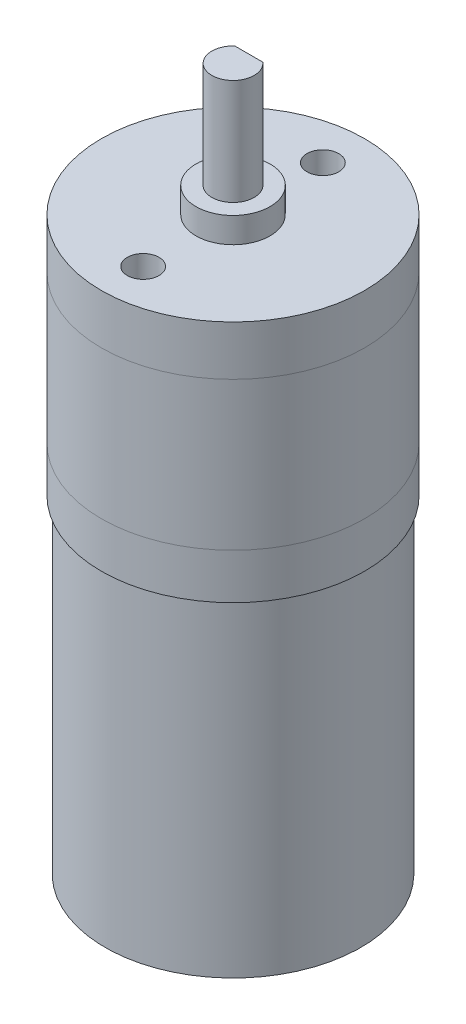
ISO-10303-21;
HEADER;
FILE_DESCRIPTION(('STEP AP214'),'2;1');
FILE_NAME('part.step','',(''),(''),'','','');
FILE_SCHEMA(('AUTOMOTIVE_DESIGN { 1 0 10303 214 1 1 1 1 }'));
ENDSEC;
DATA;
#1=APPLICATION_CONTEXT('core data for automotive mechanical design processes');
#2=APPLICATION_PROTOCOL_DEFINITION('international standard','automotive_design',2000,#1);
#3=PRODUCT_CONTEXT('',#1,'mechanical');
#4=PRODUCT('Part','Part','',(#3));
#5=PRODUCT_RELATED_PRODUCT_CATEGORY('part','',(#4));
#6=PRODUCT_DEFINITION_FORMATION('','',#4);
#7=PRODUCT_DEFINITION_CONTEXT('part definition',#1,'design');
#8=PRODUCT_DEFINITION('design','',#6,#7);
#9=PRODUCT_DEFINITION_SHAPE('','',#8);
#10=(LENGTH_UNIT() NAMED_UNIT(*) SI_UNIT(.MILLI.,.METRE.));
#11=(NAMED_UNIT(*) PLANE_ANGLE_UNIT() SI_UNIT($,.RADIAN.));
#12=(NAMED_UNIT(*) SI_UNIT($,.STERADIAN.) SOLID_ANGLE_UNIT());
#13=UNCERTAINTY_MEASURE_WITH_UNIT(LENGTH_MEASURE(1.E-05),#10,'distance_accuracy_value','');
#14=(GEOMETRIC_REPRESENTATION_CONTEXT(3) GLOBAL_UNCERTAINTY_ASSIGNED_CONTEXT((#13)) GLOBAL_UNIT_ASSIGNED_CONTEXT((#10,
#11,#12)) REPRESENTATION_CONTEXT('',''));
#15=CARTESIAN_POINT('',(0.,0.,0.));
#16=DIRECTION('',(0.,0.,1.));
#17=DIRECTION('',(1.,0.,0.));
#18=AXIS2_PLACEMENT_3D('',#15,#16,#17);
#19=CARTESIAN_POINT('',(0.,-65.4,0.));
#20=DIRECTION('',(0.,-1.,0.));
#21=DIRECTION('',(0.,0.,-1.));
#22=AXIS2_PLACEMENT_3D('',#19,#20,#21);
#23=PLANE('',#22);
#24=CARTESIAN_POINT('',(0.,-65.4,0.));
#25=DIRECTION('',(0.,-1.,0.));
#26=DIRECTION('',(0.,0.,-1.));
#27=AXIS2_PLACEMENT_3D('',#24,#25,#26);
#28=CIRCLE('',#27,11.6);
#29=CARTESIAN_POINT('',(0.,-65.4,-11.6));
#30=VERTEX_POINT('',#29);
#31=EDGE_CURVE('E217',#30,#30,#28,.T.);
#32=ORIENTED_EDGE('',*,*,#31,.T.);
#33=EDGE_LOOP('',(#32));
#34=FACE_BOUND('',#33,.T.);
#35=CARTESIAN_POINT('',(0.,-65.4,0.));
#36=DIRECTION('',(0.,-1.,0.));
#37=DIRECTION('',(0.,0.,-1.));
#38=AXIS2_PLACEMENT_3D('',#35,#36,#37);
#39=CIRCLE('',#38,3.);
#40=CARTESIAN_POINT('',(0.,-65.4,-3.));
#41=VERTEX_POINT('',#40);
#42=EDGE_CURVE('E222',#41,#41,#39,.T.);
#43=ORIENTED_EDGE('',*,*,#42,.F.);
#44=EDGE_LOOP('',(#43));
#45=FACE_BOUND('',#44,.T.);
#46=ADVANCED_FACE('F40',(#34,#45),#23,.T.);
#47=CARTESIAN_POINT('',(0.,-35.4,0.));
#48=DIRECTION('',(0.,-1.,0.));
#49=DIRECTION('',(0.,0.,-1.));
#50=AXIS2_PLACEMENT_3D('',#47,#48,#49);
#51=PLANE('',#50);
#52=CARTESIAN_POINT('',(0.,-35.4,0.));
#53=DIRECTION('',(0.,-1.,0.));
#54=DIRECTION('',(0.,0.,-1.));
#55=AXIS2_PLACEMENT_3D('',#52,#53,#54);
#56=CIRCLE('',#55,12.4500000000001);
#57=CARTESIAN_POINT('',(0.,-35.4,-12.4500000000001));
#58=VERTEX_POINT('',#57);
#59=EDGE_CURVE('E207',#58,#58,#56,.T.);
#60=ORIENTED_EDGE('',*,*,#59,.T.);
#61=EDGE_LOOP('',(#60));
#62=FACE_BOUND('',#61,.T.);
#63=CARTESIAN_POINT('',(0.,-35.4,0.));
#64=DIRECTION('',(0.,-1.,0.));
#65=DIRECTION('',(0.,0.,-1.));
#66=AXIS2_PLACEMENT_3D('',#63,#64,#65);
#67=CIRCLE('',#66,12.1);
#68=CARTESIAN_POINT('',(0.,-35.4,-12.1));
#69=VERTEX_POINT('',#68);
#70=EDGE_CURVE('E213',#69,#69,#67,.T.);
#71=ORIENTED_EDGE('',*,*,#70,.F.);
#72=EDGE_LOOP('',(#71));
#73=FACE_BOUND('',#72,.T.);
#74=ADVANCED_FACE('F141',(#62,#73),#51,.T.);
#75=CARTESIAN_POINT('',(0.,-8.,-1.5));
#76=DIRECTION('',(0.,0.,1.));
#77=DIRECTION('',(1.,0.,0.));
#78=AXIS2_PLACEMENT_3D('',#75,#76,#77);
#79=PLANE('',#78);
#80=DIRECTION('',(1.,0.,0.));
#81=VECTOR('',#80,1.);
#82=CARTESIAN_POINT('',(0.,0.,-1.5));
#83=LINE('',#82,#81);
#84=CARTESIAN_POINT('',(-1.3228756555323,0.,-1.5));
#85=VERTEX_POINT('',#84);
#86=CARTESIAN_POINT('',(1.3228756555323,0.,-1.5));
#87=VERTEX_POINT('',#86);
#88=EDGE_CURVE('E71',#85,#87,#83,.T.);
#89=ORIENTED_EDGE('',*,*,#88,.T.);
#90=DIRECTION('',(0.,1.,0.));
#91=VECTOR('',#90,1.);
#92=CARTESIAN_POINT('',(1.3228756555323,-8.,-1.5));
#93=LINE('',#92,#91);
#94=CARTESIAN_POINT('',(1.32287565553229,-8.,-1.5));
#95=VERTEX_POINT('',#94);
#96=EDGE_CURVE('E66',#95,#87,#93,.T.);
#97=ORIENTED_EDGE('',*,*,#96,.F.);
#98=DIRECTION('',(1.,0.,0.));
#99=VECTOR('',#98,1.);
#100=CARTESIAN_POINT('',(0.,-8.,-1.5));
#101=LINE('',#100,#99);
#102=CARTESIAN_POINT('',(-1.3228756555323,-8.,-1.5));
#103=VERTEX_POINT('',#102);
#104=EDGE_CURVE('E69',#103,#95,#101,.T.);
#105=ORIENTED_EDGE('',*,*,#104,.F.);
#106=DIRECTION('',(0.,1.,0.));
#107=VECTOR('',#106,1.);
#108=CARTESIAN_POINT('',(-1.3228756555323,-8.,-1.5));
#109=LINE('',#108,#107);
#110=EDGE_CURVE('E56',#103,#85,#109,.T.);
#111=ORIENTED_EDGE('',*,*,#110,.T.);
#112=EDGE_LOOP('',(#89,#97,#105,#111));
#113=FACE_BOUND('',#112,.T.);
#114=ADVANCED_FACE('F68',(#113),#79,.F.);
#115=CARTESIAN_POINT('',(0.,-8.,0.));
#116=DIRECTION('',(0.,1.,0.));
#117=DIRECTION('',(0.,0.,1.));
#118=AXIS2_PLACEMENT_3D('',#115,#116,#117);
#119=CYLINDRICAL_SURFACE('',#118,2.);
#120=CARTESIAN_POINT('',(0.,0.,0.));
#121=DIRECTION('',(0.,1.,0.));
#122=DIRECTION('',(0.,0.,1.));
#123=AXIS2_PLACEMENT_3D('',#120,#121,#122);
#124=CIRCLE('',#123,2.);
#125=EDGE_CURVE('E77',#85,#87,#124,.T.);
#126=ORIENTED_EDGE('',*,*,#125,.F.);
#127=ORIENTED_EDGE('',*,*,#110,.F.);
#128=CARTESIAN_POINT('',(0.,-8.,0.));
#129=DIRECTION('',(0.,-1.,0.));
#130=DIRECTION('',(0.,0.,-1.));
#131=AXIS2_PLACEMENT_3D('',#128,#129,#130);
#132=CIRCLE('',#131,2.);
#133=EDGE_CURVE('E76',#103,#95,#132,.T.);
#134=ORIENTED_EDGE('',*,*,#133,.T.);
#135=ORIENTED_EDGE('',*,*,#96,.T.);
#136=EDGE_LOOP('',(#126,#127,#134,#135));
#137=FACE_BOUND('',#136,.T.);
#138=CARTESIAN_POINT('',(0.,-10.,0.));
#139=DIRECTION('',(0.,-1.,0.));
#140=DIRECTION('',(0.,0.,-1.));
#141=AXIS2_PLACEMENT_3D('',#138,#139,#140);
#142=CIRCLE('',#141,2.);
#143=CARTESIAN_POINT('',(0.,-10.,-2.));
#144=VERTEX_POINT('',#143);
#145=EDGE_CURVE('E81',#144,#144,#142,.T.);
#146=ORIENTED_EDGE('',*,*,#145,.F.);
#147=EDGE_LOOP('',(#146));
#148=FACE_BOUND('',#147,.T.);
#149=ADVANCED_FACE('F79',(#137,#148),#119,.T.);
#150=CARTESIAN_POINT('',(0.,0.,0.));
#151=DIRECTION('',(0.,1.,0.));
#152=DIRECTION('',(0.,0.,1.));
#153=AXIS2_PLACEMENT_3D('',#150,#151,#152);
#154=PLANE('',#153);
#155=ORIENTED_EDGE('',*,*,#88,.F.);
#156=ORIENTED_EDGE('',*,*,#125,.T.);
#157=EDGE_LOOP('',(#155,#156));
#158=FACE_BOUND('',#157,.T.);
#159=ADVANCED_FACE('F135',(#158),#154,.T.);
#160=CARTESIAN_POINT('',(0.,-8.,0.));
#161=DIRECTION('',(0.,-1.,0.));
#162=DIRECTION('',(0.,0.,-1.));
#163=AXIS2_PLACEMENT_3D('',#160,#161,#162);
#164=PLANE('',#163);
#165=ORIENTED_EDGE('',*,*,#133,.F.);
#166=ORIENTED_EDGE('',*,*,#104,.T.);
#167=EDGE_LOOP('',(#165,#166));
#168=FACE_BOUND('',#167,.T.);
#169=ADVANCED_FACE('F75',(#168),#164,.F.);
#170=CARTESIAN_POINT('',(0.,-12.4,0.));
#171=DIRECTION('',(0.,1.,0.));
#172=DIRECTION('',(0.,0.,1.));
#173=AXIS2_PLACEMENT_3D('',#170,#171,#172);
#174=CYLINDRICAL_SURFACE('',#173,3.5);
#175=CARTESIAN_POINT('',(0.,-12.4,0.));
#176=DIRECTION('',(0.,-1.,0.));
#177=DIRECTION('',(0.,0.,-1.));
#178=AXIS2_PLACEMENT_3D('',#175,#176,#177);
#179=CIRCLE('',#178,3.5);
#180=CARTESIAN_POINT('',(0.,-12.4,-3.5));
#181=VERTEX_POINT('',#180);
#182=EDGE_CURVE('E82',#181,#181,#179,.T.);
#183=ORIENTED_EDGE('',*,*,#182,.F.);
#184=EDGE_LOOP('',(#183));
#185=FACE_BOUND('',#184,.T.);
#186=CARTESIAN_POINT('',(0.,-10.,0.));
#187=DIRECTION('',(0.,-1.,0.));
#188=DIRECTION('',(0.,0.,-1.));
#189=AXIS2_PLACEMENT_3D('',#186,#187,#188);
#190=CIRCLE('',#189,3.5);
#191=CARTESIAN_POINT('',(0.,-10.,-3.5));
#192=VERTEX_POINT('',#191);
#193=EDGE_CURVE('E87',#192,#192,#190,.T.);
#194=ORIENTED_EDGE('',*,*,#193,.T.);
#195=EDGE_LOOP('',(#194));
#196=FACE_BOUND('',#195,.T.);
#197=ADVANCED_FACE('F128',(#185,#196),#174,.T.);
#198=CARTESIAN_POINT('',(0.,-10.,0.));
#199=DIRECTION('',(0.,-1.,0.));
#200=DIRECTION('',(0.,0.,-1.));
#201=AXIS2_PLACEMENT_3D('',#198,#199,#200);
#202=PLANE('',#201);
#203=ORIENTED_EDGE('',*,*,#145,.T.);
#204=EDGE_LOOP('',(#203));
#205=FACE_BOUND('',#204,.T.);
#206=ORIENTED_EDGE('',*,*,#193,.F.);
#207=EDGE_LOOP('',(#206));
#208=FACE_BOUND('',#207,.T.);
#209=ADVANCED_FACE('F125',(#205,#208),#202,.F.);
#210=CARTESIAN_POINT('',(0.,-12.4,0.));
#211=DIRECTION('',(0.,-1.,0.));
#212=DIRECTION('',(0.,0.,-1.));
#213=AXIS2_PLACEMENT_3D('',#210,#211,#212);
#214=PLANE('',#213);
#215=CARTESIAN_POINT('',(0.,-12.4,8.5));
#216=DIRECTION('',(0.,1.,0.));
#217=DIRECTION('',(0.,0.,1.));
#218=AXIS2_PLACEMENT_3D('',#215,#216,#217);
#219=CIRCLE('',#218,1.5);
#220=CARTESIAN_POINT('',(0.,-12.4,10.));
#221=VERTEX_POINT('',#220);
#222=EDGE_CURVE('E233',#221,#221,#219,.T.);
#223=ORIENTED_EDGE('',*,*,#222,.F.);
#224=EDGE_LOOP('',(#223));
#225=FACE_BOUND('',#224,.T.);
#226=CARTESIAN_POINT('',(0.,-12.4,-8.5));
#227=DIRECTION('',(0.,1.,0.));
#228=DIRECTION('',(0.,0.,1.));
#229=AXIS2_PLACEMENT_3D('',#226,#227,#228);
#230=CIRCLE('',#229,1.5);
#231=CARTESIAN_POINT('',(0.,-12.4,-7.));
#232=VERTEX_POINT('',#231);
#233=EDGE_CURVE('E227',#232,#232,#230,.T.);
#234=ORIENTED_EDGE('',*,*,#233,.F.);
#235=EDGE_LOOP('',(#234));
#236=FACE_BOUND('',#235,.T.);
#237=CARTESIAN_POINT('',(0.,-12.4,0.));
#238=DIRECTION('',(0.,-1.,0.));
#239=DIRECTION('',(0.,0.,-1.));
#240=AXIS2_PLACEMENT_3D('',#237,#238,#239);
#241=CIRCLE('',#240,12.45);
#242=CARTESIAN_POINT('',(0.,-12.4,-12.45));
#243=VERTEX_POINT('',#242);
#244=EDGE_CURVE('E192',#243,#243,#241,.T.);
#245=ORIENTED_EDGE('',*,*,#244,.F.);
#246=EDGE_LOOP('',(#245));
#247=FACE_BOUND('',#246,.T.);
#248=ORIENTED_EDGE('',*,*,#182,.T.);
#249=EDGE_LOOP('',(#248));
#250=FACE_BOUND('',#249,.T.);
#251=ADVANCED_FACE('F123',(#225,#236,#247,#250),#214,.F.);
#252=CARTESIAN_POINT('',(0.,-17.1,0.));
#253=DIRECTION('',(0.,1.,0.));
#254=DIRECTION('',(0.,0.,1.));
#255=AXIS2_PLACEMENT_3D('',#252,#253,#254);
#256=CYLINDRICAL_SURFACE('',#255,12.45);
#257=CARTESIAN_POINT('',(0.,-17.1,0.));
#258=DIRECTION('',(0.,-1.,0.));
#259=DIRECTION('',(0.,0.,-1.));
#260=AXIS2_PLACEMENT_3D('',#257,#258,#259);
#261=CIRCLE('',#260,12.4495);
#262=CARTESIAN_POINT('',(0.,-17.1,-12.4495));
#263=VERTEX_POINT('',#262);
#264=EDGE_CURVE('E105',#263,#263,#261,.T.);
#265=ORIENTED_EDGE('',*,*,#264,.F.);
#266=EDGE_LOOP('',(#265));
#267=FACE_BOUND('',#266,.T.);
#268=ORIENTED_EDGE('',*,*,#244,.T.);
#269=EDGE_LOOP('',(#268));
#270=FACE_BOUND('',#269,.T.);
#271=ADVANCED_FACE('F112',(#267,#270),#256,.T.);
#272=CARTESIAN_POINT('',(0.,-31.1,0.));
#273=DIRECTION('',(0.,1.,0.));
#274=DIRECTION('',(0.,0.,1.));
#275=AXIS2_PLACEMENT_3D('',#272,#273,#274);
#276=CYLINDRICAL_SURFACE('',#275,12.4495);
#277=CARTESIAN_POINT('',(0.,-31.1,0.));
#278=DIRECTION('',(0.,-1.,0.));
#279=DIRECTION('',(0.,0.,-1.));
#280=AXIS2_PLACEMENT_3D('',#277,#278,#279);
#281=CIRCLE('',#280,12.4500000000001);
#282=CARTESIAN_POINT('',(0.,-31.1,-12.4500000000001));
#283=VERTEX_POINT('',#282);
#284=EDGE_CURVE('E199',#283,#283,#281,.T.);
#285=ORIENTED_EDGE('',*,*,#284,.F.);
#286=EDGE_LOOP('',(#285));
#287=FACE_BOUND('',#286,.T.);
#288=ORIENTED_EDGE('',*,*,#264,.T.);
#289=EDGE_LOOP('',(#288));
#290=FACE_BOUND('',#289,.T.);
#291=ADVANCED_FACE('F122',(#287,#290),#276,.T.);
#292=CARTESIAN_POINT('',(0.,-35.4,0.));
#293=DIRECTION('',(0.,1.,0.));
#294=DIRECTION('',(0.,0.,1.));
#295=AXIS2_PLACEMENT_3D('',#292,#293,#294);
#296=CYLINDRICAL_SURFACE('',#295,12.4500000000001);
#297=ORIENTED_EDGE('',*,*,#59,.F.);
#298=EDGE_LOOP('',(#297));
#299=FACE_BOUND('',#298,.T.);
#300=ORIENTED_EDGE('',*,*,#284,.T.);
#301=EDGE_LOOP('',(#300));
#302=FACE_BOUND('',#301,.T.);
#303=ADVANCED_FACE('F168',(#299,#302),#296,.T.);
#304=CARTESIAN_POINT('',(0.,-66.4,0.));
#305=DIRECTION('',(0.,1.,0.));
#306=DIRECTION('',(0.,0.,1.));
#307=AXIS2_PLACEMENT_3D('',#304,#305,#306);
#308=CYLINDRICAL_SURFACE('',#307,12.1);
#309=CARTESIAN_POINT('',(0.,-66.4,0.));
#310=DIRECTION('',(0.,-1.,0.));
#311=DIRECTION('',(0.,0.,-1.));
#312=AXIS2_PLACEMENT_3D('',#309,#310,#311);
#313=CIRCLE('',#312,12.1);
#314=CARTESIAN_POINT('',(0.,-66.4,-12.1));
#315=VERTEX_POINT('',#314);
#316=EDGE_CURVE('E210',#315,#315,#313,.T.);
#317=ORIENTED_EDGE('',*,*,#316,.F.);
#318=EDGE_LOOP('',(#317));
#319=FACE_BOUND('',#318,.T.);
#320=ORIENTED_EDGE('',*,*,#70,.T.);
#321=EDGE_LOOP('',(#320));
#322=FACE_BOUND('',#321,.T.);
#323=ADVANCED_FACE('F165',(#319,#322),#308,.T.);
#324=CARTESIAN_POINT('',(0.,-66.4,0.));
#325=DIRECTION('',(0.,-1.,0.));
#326=DIRECTION('',(0.,0.,-1.));
#327=AXIS2_PLACEMENT_3D('',#324,#325,#326);
#328=PLANE('',#327);
#329=CARTESIAN_POINT('',(0.,-66.4,0.));
#330=DIRECTION('',(0.,-1.,0.));
#331=DIRECTION('',(0.,0.,-1.));
#332=AXIS2_PLACEMENT_3D('',#329,#330,#331);
#333=CIRCLE('',#332,11.6);
#334=CARTESIAN_POINT('',(0.,-66.4,-11.6));
#335=VERTEX_POINT('',#334);
#336=EDGE_CURVE('E219',#335,#335,#333,.T.);
#337=ORIENTED_EDGE('',*,*,#336,.F.);
#338=EDGE_LOOP('',(#337));
#339=FACE_BOUND('',#338,.T.);
#340=ORIENTED_EDGE('',*,*,#316,.T.);
#341=EDGE_LOOP('',(#340));
#342=FACE_BOUND('',#341,.T.);
#343=ADVANCED_FACE('F161',(#339,#342),#328,.T.);
#344=CARTESIAN_POINT('',(0.,-65.4,0.));
#345=DIRECTION('',(0.,-1.,0.));
#346=DIRECTION('',(0.,0.,-1.));
#347=AXIS2_PLACEMENT_3D('',#344,#345,#346);
#348=CYLINDRICAL_SURFACE('',#347,11.6);
#349=ORIENTED_EDGE('',*,*,#31,.F.);
#350=EDGE_LOOP('',(#349));
#351=FACE_BOUND('',#350,.T.);
#352=ORIENTED_EDGE('',*,*,#336,.T.);
#353=EDGE_LOOP('',(#352));
#354=FACE_BOUND('',#353,.T.);
#355=ADVANCED_FACE('F158',(#351,#354),#348,.F.);
#356=CARTESIAN_POINT('',(0.,-67.4,0.));
#357=DIRECTION('',(0.,1.,0.));
#358=DIRECTION('',(0.,0.,1.));
#359=AXIS2_PLACEMENT_3D('',#356,#357,#358);
#360=CYLINDRICAL_SURFACE('',#359,3.);
#361=CARTESIAN_POINT('',(0.,-66.4,0.));
#362=DIRECTION('',(0.,-1.,0.));
#363=DIRECTION('',(0.,0.,-1.));
#364=AXIS2_PLACEMENT_3D('',#361,#362,#363);
#365=CIRCLE('',#364,3.);
#366=CARTESIAN_POINT('',(0.,-66.4,-3.));
#367=VERTEX_POINT('',#366);
#368=EDGE_CURVE('E11',#367,#367,#365,.F.);
#369=ORIENTED_EDGE('',*,*,#368,.T.);
#370=EDGE_LOOP('',(#369));
#371=FACE_BOUND('',#370,.T.);
#372=ORIENTED_EDGE('',*,*,#42,.T.);
#373=EDGE_LOOP('',(#372));
#374=FACE_BOUND('',#373,.T.);
#375=ADVANCED_FACE('F156',(#371,#374),#360,.T.);
#376=CARTESIAN_POINT('',(0.,-67.4,0.));
#377=DIRECTION('',(0.,-1.,0.));
#378=DIRECTION('',(0.,0.,-1.));
#379=AXIS2_PLACEMENT_3D('',#376,#377,#378);
#380=PLANE('',#379);
#381=CARTESIAN_POINT('',(0.,-67.4,0.));
#382=DIRECTION('',(0.,-1.,0.));
#383=DIRECTION('',(0.,0.,-1.));
#384=AXIS2_PLACEMENT_3D('',#381,#382,#383);
#385=CIRCLE('',#384,2.);
#386=CARTESIAN_POINT('',(0.,-67.4,-2.));
#387=VERTEX_POINT('',#386);
#388=EDGE_CURVE('E49',#387,#387,#385,.T.);
#389=ORIENTED_EDGE('',*,*,#388,.T.);
#390=EDGE_LOOP('',(#389));
#391=FACE_BOUND('',#390,.T.);
#392=ADVANCED_FACE('F265',(#391),#380,.T.);
#393=CARTESIAN_POINT('',(0.,-66.4,0.));
#394=DIRECTION('',(0.,-1.,0.));
#395=DIRECTION('',(0.,0.,-1.));
#396=AXIS2_PLACEMENT_3D('',#393,#394,#395);
#397=TOROIDAL_SURFACE('',#396,2.,1.);
#398=ORIENTED_EDGE('',*,*,#368,.F.);
#399=EDGE_LOOP('',(#398));
#400=FACE_BOUND('',#399,.T.);
#401=ORIENTED_EDGE('',*,*,#388,.F.);
#402=EDGE_LOOP('',(#401));
#403=FACE_BOUND('',#402,.T.);
#404=ADVANCED_FACE('F42',(#400,#403),#397,.T.);
#405=CARTESIAN_POINT('',(0.,-19.4,-8.5));
#406=DIRECTION('',(0.,1.,0.));
#407=DIRECTION('',(0.,0.,1.));
#408=AXIS2_PLACEMENT_3D('',#405,#406,#407);
#409=CYLINDRICAL_SURFACE('',#408,1.5);
#410=CARTESIAN_POINT('',(0.,-19.4,-8.5));
#411=DIRECTION('',(0.,1.,0.));
#412=DIRECTION('',(0.,0.,1.));
#413=AXIS2_PLACEMENT_3D('',#410,#411,#412);
#414=CIRCLE('',#413,1.5);
#415=CARTESIAN_POINT('',(0.,-19.4,-7.));
#416=VERTEX_POINT('',#415);
#417=EDGE_CURVE('E226',#416,#416,#414,.T.);
#418=ORIENTED_EDGE('',*,*,#417,.F.);
#419=EDGE_LOOP('',(#418));
#420=FACE_BOUND('',#419,.T.);
#421=ORIENTED_EDGE('',*,*,#233,.T.);
#422=EDGE_LOOP('',(#421));
#423=FACE_BOUND('',#422,.T.);
#424=ADVANCED_FACE('F255',(#420,#423),#409,.F.);
#425=CARTESIAN_POINT('',(0.,-19.4,-8.5));
#426=DIRECTION('',(0.,1.,0.));
#427=DIRECTION('',(0.,0.,1.));
#428=AXIS2_PLACEMENT_3D('',#425,#426,#427);
#429=PLANE('',#428);
#430=ORIENTED_EDGE('',*,*,#417,.T.);
#431=EDGE_LOOP('',(#430));
#432=FACE_BOUND('',#431,.T.);
#433=ADVANCED_FACE('F244',(#432),#429,.T.);
#434=CARTESIAN_POINT('',(0.,-19.4,8.5));
#435=DIRECTION('',(0.,1.,0.));
#436=DIRECTION('',(0.,0.,1.));
#437=AXIS2_PLACEMENT_3D('',#434,#435,#436);
#438=CYLINDRICAL_SURFACE('',#437,1.5);
#439=CARTESIAN_POINT('',(0.,-19.4,8.5));
#440=DIRECTION('',(0.,1.,0.));
#441=DIRECTION('',(0.,0.,1.));
#442=AXIS2_PLACEMENT_3D('',#439,#440,#441);
#443=CIRCLE('',#442,1.5);
#444=CARTESIAN_POINT('',(0.,-19.4,10.));
#445=VERTEX_POINT('',#444);
#446=EDGE_CURVE('E230',#445,#445,#443,.T.);
#447=ORIENTED_EDGE('',*,*,#446,.F.);
#448=EDGE_LOOP('',(#447));
#449=FACE_BOUND('',#448,.T.);
#450=ORIENTED_EDGE('',*,*,#222,.T.);
#451=EDGE_LOOP('',(#450));
#452=FACE_BOUND('',#451,.T.);
#453=ADVANCED_FACE('F241',(#449,#452),#438,.F.);
#454=CARTESIAN_POINT('',(0.,-19.4,8.5));
#455=DIRECTION('',(0.,1.,0.));
#456=DIRECTION('',(0.,0.,1.));
#457=AXIS2_PLACEMENT_3D('',#454,#455,#456);
#458=PLANE('',#457);
#459=ORIENTED_EDGE('',*,*,#446,.T.);
#460=EDGE_LOOP('',(#459));
#461=FACE_BOUND('',#460,.T.);
#462=ADVANCED_FACE('F239',(#461),#458,.T.);
#463=CLOSED_SHELL('',(#46,#74,#114,#149,#159,#169,#197,#209,#251,#271,#291,#303,#323,#343,#355,
#375,#392,#404,#424,#433,#453,#462));
#464=MANIFOLD_SOLID_BREP('B2',#463);
#465=ADVANCED_BREP_SHAPE_REPRESENTATION('',(#18,#464),#14);
#466=SHAPE_DEFINITION_REPRESENTATION(#9,#465);
ENDSEC;
END-ISO-10303-21;
